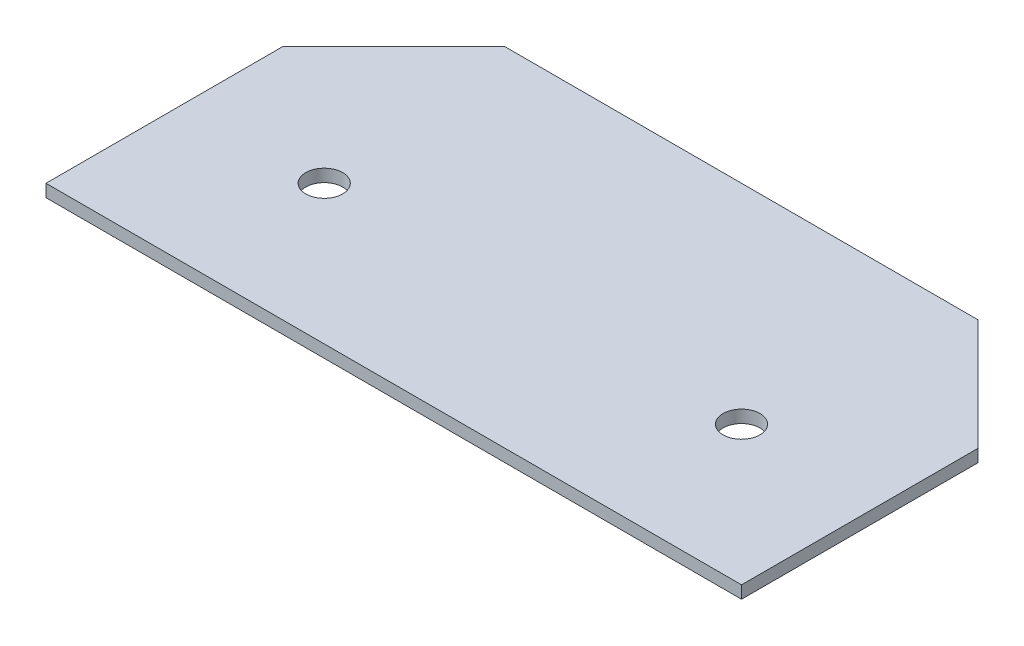
ISO-10303-21;
HEADER;
FILE_DESCRIPTION(('STEP AP214'),'2;1');
FILE_NAME('part.step','',(''),(''),'','','');
FILE_SCHEMA(('AUTOMOTIVE_DESIGN { 1 0 10303 214 1 1 1 1 }'));
ENDSEC;
DATA;
#1=APPLICATION_CONTEXT('core data for automotive mechanical design processes');
#2=APPLICATION_PROTOCOL_DEFINITION('international standard','automotive_design',2000,#1);
#3=PRODUCT_CONTEXT('',#1,'mechanical');
#4=PRODUCT('Part','Part','',(#3));
#5=PRODUCT_RELATED_PRODUCT_CATEGORY('part','',(#4));
#6=PRODUCT_DEFINITION_FORMATION('','',#4);
#7=PRODUCT_DEFINITION_CONTEXT('part definition',#1,'design');
#8=PRODUCT_DEFINITION('design','',#6,#7);
#9=PRODUCT_DEFINITION_SHAPE('','',#8);
#10=(LENGTH_UNIT() NAMED_UNIT(*) SI_UNIT(.MILLI.,.METRE.));
#11=(NAMED_UNIT(*) PLANE_ANGLE_UNIT() SI_UNIT($,.RADIAN.));
#12=(NAMED_UNIT(*) SI_UNIT($,.STERADIAN.) SOLID_ANGLE_UNIT());
#13=UNCERTAINTY_MEASURE_WITH_UNIT(LENGTH_MEASURE(1.E-05),#10,'distance_accuracy_value','');
#14=(GEOMETRIC_REPRESENTATION_CONTEXT(3) GLOBAL_UNCERTAINTY_ASSIGNED_CONTEXT((#13)) GLOBAL_UNIT_ASSIGNED_CONTEXT((#10,
#11,#12)) REPRESENTATION_CONTEXT('',''));
#15=CARTESIAN_POINT('',(0.,0.,0.));
#16=DIRECTION('',(0.,0.,1.));
#17=DIRECTION('',(1.,0.,0.));
#18=AXIS2_PLACEMENT_3D('',#15,#16,#17);
#19=CARTESIAN_POINT('',(0.,2.286,0.));
#20=DIRECTION('',(1.,0.,0.));
#21=DIRECTION('',(0.,0.,-1.));
#22=AXIS2_PLACEMENT_3D('',#19,#20,#21);
#23=PLANE('',#22);
#24=DIRECTION('',(0.,0.,1.));
#25=VECTOR('',#24,1.);
#26=CARTESIAN_POINT('',(0.,2.286,0.));
#27=LINE('',#26,#25);
#28=CARTESIAN_POINT('',(0.,2.286,-43.18));
#29=VERTEX_POINT('',#28);
#30=CARTESIAN_POINT('',(0.,2.286,0.));
#31=VERTEX_POINT('',#30);
#32=EDGE_CURVE('E89',#29,#31,#27,.T.);
#33=ORIENTED_EDGE('',*,*,#32,.F.);
#34=DIRECTION('',(0.,-1.,0.));
#35=VECTOR('',#34,1.);
#36=CARTESIAN_POINT('',(0.,2.286,-43.18));
#37=LINE('',#36,#35);
#38=CARTESIAN_POINT('',(0.,0.,-43.18));
#39=VERTEX_POINT('',#38);
#40=EDGE_CURVE('E112',#29,#39,#37,.T.);
#41=ORIENTED_EDGE('',*,*,#40,.T.);
#42=DIRECTION('',(0.,0.,1.));
#43=VECTOR('',#42,1.);
#44=CARTESIAN_POINT('',(0.,0.,0.));
#45=LINE('',#44,#43);
#46=CARTESIAN_POINT('',(0.,0.,0.));
#47=VERTEX_POINT('',#46);
#48=EDGE_CURVE('E110',#39,#47,#45,.T.);
#49=ORIENTED_EDGE('',*,*,#48,.T.);
#50=DIRECTION('',(0.,-1.,0.));
#51=VECTOR('',#50,1.);
#52=CARTESIAN_POINT('',(0.,2.286,0.));
#53=LINE('',#52,#51);
#54=EDGE_CURVE('E104',#31,#47,#53,.T.);
#55=ORIENTED_EDGE('',*,*,#54,.F.);
#56=EDGE_LOOP('',(#33,#41,#49,#55));
#57=FACE_BOUND('',#56,.T.);
#58=ADVANCED_FACE('F35',(#57),#23,.F.);
#59=CARTESIAN_POINT('',(0.,2.286,0.));
#60=DIRECTION('',(0.,0.,-1.));
#61=DIRECTION('',(-1.,0.,0.));
#62=AXIS2_PLACEMENT_3D('',#59,#60,#61);
#63=PLANE('',#62);
#64=DIRECTION('',(1.,0.,0.));
#65=VECTOR('',#64,1.);
#66=CARTESIAN_POINT('',(0.,0.,0.));
#67=LINE('',#66,#65);
#68=CARTESIAN_POINT('',(127.,0.,0.));
#69=VERTEX_POINT('',#68);
#70=EDGE_CURVE('E139',#47,#69,#67,.T.);
#71=ORIENTED_EDGE('',*,*,#70,.T.);
#72=DIRECTION('',(0.,-1.,0.));
#73=VECTOR('',#72,1.);
#74=CARTESIAN_POINT('',(127.,2.286,0.));
#75=LINE('',#74,#73);
#76=CARTESIAN_POINT('',(127.,2.286,0.));
#77=VERTEX_POINT('',#76);
#78=EDGE_CURVE('E106',#77,#69,#75,.T.);
#79=ORIENTED_EDGE('',*,*,#78,.F.);
#80=DIRECTION('',(1.,0.,0.));
#81=VECTOR('',#80,1.);
#82=CARTESIAN_POINT('',(0.,2.286,0.));
#83=LINE('',#82,#81);
#84=EDGE_CURVE('E92',#31,#77,#83,.T.);
#85=ORIENTED_EDGE('',*,*,#84,.F.);
#86=ORIENTED_EDGE('',*,*,#54,.T.);
#87=EDGE_LOOP('',(#71,#79,#85,#86));
#88=FACE_BOUND('',#87,.T.);
#89=ADVANCED_FACE('F103',(#88),#63,.F.);
#90=CARTESIAN_POINT('',(127.,2.286,0.));
#91=DIRECTION('',(-1.,0.,0.));
#92=DIRECTION('',(0.,0.,1.));
#93=AXIS2_PLACEMENT_3D('',#90,#91,#92);
#94=PLANE('',#93);
#95=DIRECTION('',(0.,0.,-1.));
#96=VECTOR('',#95,1.);
#97=CARTESIAN_POINT('',(127.,0.,0.));
#98=LINE('',#97,#96);
#99=CARTESIAN_POINT('',(127.,0.,-43.1799999999999));
#100=VERTEX_POINT('',#99);
#101=EDGE_CURVE('E137',#69,#100,#98,.T.);
#102=ORIENTED_EDGE('',*,*,#101,.T.);
#103=DIRECTION('',(0.,1.,0.));
#104=VECTOR('',#103,1.);
#105=CARTESIAN_POINT('',(127.,2.286,-43.1799999999999));
#106=LINE('',#105,#104);
#107=CARTESIAN_POINT('',(127.,2.286,-43.1799999999999));
#108=VERTEX_POINT('',#107);
#109=EDGE_CURVE('E11',#100,#108,#106,.T.);
#110=ORIENTED_EDGE('',*,*,#109,.T.);
#111=DIRECTION('',(0.,0.,-1.));
#112=VECTOR('',#111,1.);
#113=CARTESIAN_POINT('',(127.,2.286,0.));
#114=LINE('',#113,#112);
#115=EDGE_CURVE('E107',#77,#108,#114,.T.);
#116=ORIENTED_EDGE('',*,*,#115,.F.);
#117=ORIENTED_EDGE('',*,*,#78,.T.);
#118=EDGE_LOOP('',(#102,#110,#116,#117));
#119=FACE_BOUND('',#118,.T.);
#120=ADVANCED_FACE('F138',(#119),#94,.F.);
#121=CARTESIAN_POINT('',(0.,2.286,-63.5));
#122=DIRECTION('',(0.,0.,1.));
#123=DIRECTION('',(1.,0.,0.));
#124=AXIS2_PLACEMENT_3D('',#121,#122,#123);
#125=PLANE('',#124);
#126=DIRECTION('',(-1.,0.,0.));
#127=VECTOR('',#126,1.);
#128=CARTESIAN_POINT('',(0.,0.,-63.5));
#129=LINE('',#128,#127);
#130=CARTESIAN_POINT('',(106.68,0.,-63.5));
#131=VERTEX_POINT('',#130);
#132=CARTESIAN_POINT('',(20.3200000000001,0.,-63.5));
#133=VERTEX_POINT('',#132);
#134=EDGE_CURVE('E99',#131,#133,#129,.T.);
#135=ORIENTED_EDGE('',*,*,#134,.T.);
#136=DIRECTION('',(0.,1.,0.));
#137=VECTOR('',#136,1.);
#138=CARTESIAN_POINT('',(20.3200000000001,2.286,-63.5));
#139=LINE('',#138,#137);
#140=CARTESIAN_POINT('',(20.3200000000001,2.286,-63.5));
#141=VERTEX_POINT('',#140);
#142=EDGE_CURVE('E56',#133,#141,#139,.T.);
#143=ORIENTED_EDGE('',*,*,#142,.T.);
#144=DIRECTION('',(-1.,0.,0.));
#145=VECTOR('',#144,1.);
#146=CARTESIAN_POINT('',(0.,2.286,-63.5));
#147=LINE('',#146,#145);
#148=CARTESIAN_POINT('',(106.68,2.286,-63.5));
#149=VERTEX_POINT('',#148);
#150=EDGE_CURVE('E116',#149,#141,#147,.T.);
#151=ORIENTED_EDGE('',*,*,#150,.F.);
#152=DIRECTION('',(0.,-1.,0.));
#153=VECTOR('',#152,1.);
#154=CARTESIAN_POINT('',(106.68,2.286,-63.5));
#155=LINE('',#154,#153);
#156=EDGE_CURVE('E123',#149,#131,#155,.T.);
#157=ORIENTED_EDGE('',*,*,#156,.T.);
#158=EDGE_LOOP('',(#135,#143,#151,#157));
#159=FACE_BOUND('',#158,.T.);
#160=ADVANCED_FACE('F131',(#159),#125,.F.);
#161=CARTESIAN_POINT('',(0.,2.286,0.));
#162=DIRECTION('',(0.,-1.,0.));
#163=DIRECTION('',(0.,0.,-1.));
#164=AXIS2_PLACEMENT_3D('',#161,#162,#163);
#165=PLANE('',#164);
#166=CARTESIAN_POINT('',(101.6,2.286,-25.4));
#167=DIRECTION('',(0.,1.,0.));
#168=DIRECTION('',(0.,0.,1.));
#169=AXIS2_PLACEMENT_3D('',#166,#167,#168);
#170=CIRCLE('',#169,3.3734375);
#171=CARTESIAN_POINT('',(101.6,2.286,-22.0265625));
#172=VERTEX_POINT('',#171);
#173=EDGE_CURVE('E152',#172,#172,#170,.T.);
#174=ORIENTED_EDGE('',*,*,#173,.F.);
#175=EDGE_LOOP('',(#174));
#176=FACE_BOUND('',#175,.T.);
#177=CARTESIAN_POINT('',(25.4,2.286,-25.4));
#178=DIRECTION('',(0.,1.,0.));
#179=DIRECTION('',(0.,0.,1.));
#180=AXIS2_PLACEMENT_3D('',#177,#178,#179);
#181=CIRCLE('',#180,3.3734375);
#182=CARTESIAN_POINT('',(25.4,2.286,-22.0265625));
#183=VERTEX_POINT('',#182);
#184=EDGE_CURVE('E146',#183,#183,#181,.T.);
#185=ORIENTED_EDGE('',*,*,#184,.F.);
#186=EDGE_LOOP('',(#185));
#187=FACE_BOUND('',#186,.T.);
#188=ORIENTED_EDGE('',*,*,#150,.T.);
#189=DIRECTION('',(0.707106781186549,0.,-0.707106781186546));
#190=VECTOR('',#189,1.);
#191=CARTESIAN_POINT('',(0.,2.286,-43.18));
#192=LINE('',#191,#190);
#193=EDGE_CURVE('E43',#141,#29,#192,.F.);
#194=ORIENTED_EDGE('',*,*,#193,.T.);
#195=ORIENTED_EDGE('',*,*,#32,.T.);
#196=ORIENTED_EDGE('',*,*,#84,.T.);
#197=ORIENTED_EDGE('',*,*,#115,.T.);
#198=DIRECTION('',(0.707106781186546,0.,0.707106781186549));
#199=VECTOR('',#198,1.);
#200=CARTESIAN_POINT('',(106.68,2.286,-63.5));
#201=LINE('',#200,#199);
#202=EDGE_CURVE('E127',#108,#149,#201,.F.);
#203=ORIENTED_EDGE('',*,*,#202,.T.);
#204=EDGE_LOOP('',(#188,#194,#195,#196,#197,#203));
#205=FACE_BOUND('',#204,.T.);
#206=ADVANCED_FACE('F91',(#176,#187,#205),#165,.F.);
#207=CARTESIAN_POINT('',(0.,0.,0.));
#208=DIRECTION('',(0.,-1.,0.));
#209=DIRECTION('',(0.,0.,-1.));
#210=AXIS2_PLACEMENT_3D('',#207,#208,#209);
#211=PLANE('',#210);
#212=CARTESIAN_POINT('',(101.6,0.,-25.4));
#213=DIRECTION('',(0.,1.,0.));
#214=DIRECTION('',(0.,0.,1.));
#215=AXIS2_PLACEMENT_3D('',#212,#213,#214);
#216=CIRCLE('',#215,3.3734375);
#217=CARTESIAN_POINT('',(101.6,0.,-22.0265625));
#218=VERTEX_POINT('',#217);
#219=EDGE_CURVE('E149',#218,#218,#216,.T.);
#220=ORIENTED_EDGE('',*,*,#219,.T.);
#221=EDGE_LOOP('',(#220));
#222=FACE_BOUND('',#221,.T.);
#223=CARTESIAN_POINT('',(25.4,0.,-25.4));
#224=DIRECTION('',(0.,1.,0.));
#225=DIRECTION('',(0.,0.,1.));
#226=AXIS2_PLACEMENT_3D('',#223,#224,#225);
#227=CIRCLE('',#226,3.3734375);
#228=CARTESIAN_POINT('',(25.4,0.,-22.0265625));
#229=VERTEX_POINT('',#228);
#230=EDGE_CURVE('E143',#229,#229,#227,.T.);
#231=ORIENTED_EDGE('',*,*,#230,.T.);
#232=EDGE_LOOP('',(#231));
#233=FACE_BOUND('',#232,.T.);
#234=ORIENTED_EDGE('',*,*,#48,.F.);
#235=DIRECTION('',(-0.707106781186549,0.,0.707106781186546));
#236=VECTOR('',#235,1.);
#237=CARTESIAN_POINT('',(-21.59,0.,-21.5900000000001));
#238=LINE('',#237,#236);
#239=EDGE_CURVE('E121',#39,#133,#238,.F.);
#240=ORIENTED_EDGE('',*,*,#239,.T.);
#241=ORIENTED_EDGE('',*,*,#134,.F.);
#242=DIRECTION('',(-0.707106781186546,0.,-0.707106781186549));
#243=VECTOR('',#242,1.);
#244=CARTESIAN_POINT('',(85.0900000000002,0.,-85.0899999999998));
#245=LINE('',#244,#243);
#246=EDGE_CURVE('E114',#131,#100,#245,.F.);
#247=ORIENTED_EDGE('',*,*,#246,.T.);
#248=ORIENTED_EDGE('',*,*,#101,.F.);
#249=ORIENTED_EDGE('',*,*,#70,.F.);
#250=EDGE_LOOP('',(#234,#240,#241,#247,#248,#249));
#251=FACE_BOUND('',#250,.T.);
#252=ADVANCED_FACE('F136',(#222,#233,#251),#211,.T.);
#253=CARTESIAN_POINT('',(25.4,0.,-25.4));
#254=DIRECTION('',(0.,1.,0.));
#255=DIRECTION('',(0.,0.,1.));
#256=AXIS2_PLACEMENT_3D('',#253,#254,#255);
#257=CYLINDRICAL_SURFACE('',#256,3.3734375);
#258=ORIENTED_EDGE('',*,*,#230,.F.);
#259=EDGE_LOOP('',(#258));
#260=FACE_BOUND('',#259,.T.);
#261=ORIENTED_EDGE('',*,*,#184,.T.);
#262=EDGE_LOOP('',(#261));
#263=FACE_BOUND('',#262,.T.);
#264=ADVANCED_FACE('F164',(#260,#263),#257,.F.);
#265=CARTESIAN_POINT('',(101.6,0.,-25.4));
#266=DIRECTION('',(0.,1.,0.));
#267=DIRECTION('',(0.,0.,1.));
#268=AXIS2_PLACEMENT_3D('',#265,#266,#267);
#269=CYLINDRICAL_SURFACE('',#268,3.3734375);
#270=ORIENTED_EDGE('',*,*,#219,.F.);
#271=EDGE_LOOP('',(#270));
#272=FACE_BOUND('',#271,.T.);
#273=ORIENTED_EDGE('',*,*,#173,.T.);
#274=EDGE_LOOP('',(#273));
#275=FACE_BOUND('',#274,.T.);
#276=ADVANCED_FACE('F160',(#272,#275),#269,.F.);
#277=CARTESIAN_POINT('',(0.,2.286,-43.18));
#278=DIRECTION('',(0.707106781186546,0.,0.707106781186549));
#279=DIRECTION('',(0.,-1.,0.));
#280=AXIS2_PLACEMENT_3D('',#277,#278,#279);
#281=PLANE('',#280);
#282=ORIENTED_EDGE('',*,*,#193,.F.);
#283=ORIENTED_EDGE('',*,*,#142,.F.);
#284=ORIENTED_EDGE('',*,*,#239,.F.);
#285=ORIENTED_EDGE('',*,*,#40,.F.);
#286=EDGE_LOOP('',(#282,#283,#284,#285));
#287=FACE_BOUND('',#286,.T.);
#288=ADVANCED_FACE('F163',(#287),#281,.F.);
#289=CARTESIAN_POINT('',(106.68,2.286,-63.5));
#290=DIRECTION('',(-0.707106781186549,0.,0.707106781186546));
#291=DIRECTION('',(0.,-1.,0.));
#292=AXIS2_PLACEMENT_3D('',#289,#290,#291);
#293=PLANE('',#292);
#294=ORIENTED_EDGE('',*,*,#202,.F.);
#295=ORIENTED_EDGE('',*,*,#109,.F.);
#296=ORIENTED_EDGE('',*,*,#246,.F.);
#297=ORIENTED_EDGE('',*,*,#156,.F.);
#298=EDGE_LOOP('',(#294,#295,#296,#297));
#299=FACE_BOUND('',#298,.T.);
#300=ADVANCED_FACE('F37',(#299),#293,.F.);
#301=CLOSED_SHELL('',(#58,#89,#120,#160,#206,#252,#264,#276,#288,#300));
#302=MANIFOLD_SOLID_BREP('B2',#301);
#303=ADVANCED_BREP_SHAPE_REPRESENTATION('',(#18,#302),#14);
#304=SHAPE_DEFINITION_REPRESENTATION(#9,#303);
ENDSEC;
END-ISO-10303-21;
